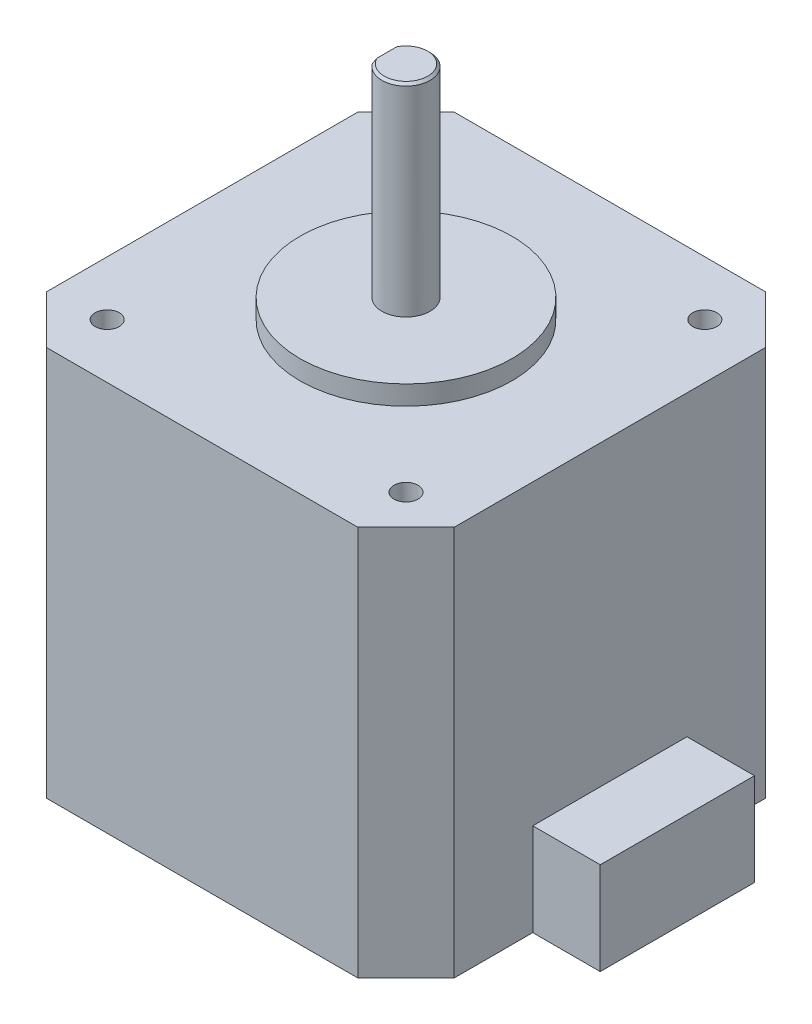
ISO-10303-21;
HEADER;
FILE_DESCRIPTION(('STEP AP214'),'2;1');
FILE_NAME('part.step','',(''),(''),'','','');
FILE_SCHEMA(('AUTOMOTIVE_DESIGN { 1 0 10303 214 1 1 1 1 }'));
ENDSEC;
DATA;
#1=APPLICATION_CONTEXT('core data for automotive mechanical design processes');
#2=APPLICATION_PROTOCOL_DEFINITION('international standard','automotive_design',2000,#1);
#3=PRODUCT_CONTEXT('',#1,'mechanical');
#4=PRODUCT('Part','Part','',(#3));
#5=PRODUCT_RELATED_PRODUCT_CATEGORY('part','',(#4));
#6=PRODUCT_DEFINITION_FORMATION('','',#4);
#7=PRODUCT_DEFINITION_CONTEXT('part definition',#1,'design');
#8=PRODUCT_DEFINITION('design','',#6,#7);
#9=PRODUCT_DEFINITION_SHAPE('','',#8);
#10=(LENGTH_UNIT() NAMED_UNIT(*) SI_UNIT(.MILLI.,.METRE.));
#11=(NAMED_UNIT(*) PLANE_ANGLE_UNIT() SI_UNIT($,.RADIAN.));
#12=(NAMED_UNIT(*) SI_UNIT($,.STERADIAN.) SOLID_ANGLE_UNIT());
#13=UNCERTAINTY_MEASURE_WITH_UNIT(LENGTH_MEASURE(1.E-05),#10,'distance_accuracy_value','');
#14=(GEOMETRIC_REPRESENTATION_CONTEXT(3) GLOBAL_UNCERTAINTY_ASSIGNED_CONTEXT((#13)) GLOBAL_UNIT_ASSIGNED_CONTEXT((#10,
#11,#12)) REPRESENTATION_CONTEXT('',''));
#15=CARTESIAN_POINT('',(0.,0.,0.));
#16=DIRECTION('',(0.,0.,1.));
#17=DIRECTION('',(1.,0.,0.));
#18=AXIS2_PLACEMENT_3D('',#15,#16,#17);
#19=CARTESIAN_POINT('',(21.15,40.5,-21.15));
#20=DIRECTION('',(-1.,0.,0.));
#21=DIRECTION('',(0.,0.,1.));
#22=AXIS2_PLACEMENT_3D('',#19,#20,#21);
#23=PLANE('',#22);
#24=DIRECTION('',(0.,1.,0.));
#25=VECTOR('',#24,1.);
#26=CARTESIAN_POINT('',(21.15,9.6,-8.));
#27=LINE('',#26,#25);
#28=CARTESIAN_POINT('',(21.15,0.,-8.));
#29=VERTEX_POINT('',#28);
#30=CARTESIAN_POINT('',(21.15,9.6,-8.));
#31=VERTEX_POINT('',#30);
#32=EDGE_CURVE('E78',#29,#31,#27,.T.);
#33=ORIENTED_EDGE('',*,*,#32,.F.);
#34=DIRECTION('',(0.,0.,-1.));
#35=VECTOR('',#34,1.);
#36=CARTESIAN_POINT('',(21.15,0.,-21.15));
#37=LINE('',#36,#35);
#38=CARTESIAN_POINT('',(21.15,0.,-16.15));
#39=VERTEX_POINT('',#38);
#40=EDGE_CURVE('E274',#29,#39,#37,.T.);
#41=ORIENTED_EDGE('',*,*,#40,.T.);
#42=DIRECTION('',(0.,1.,0.));
#43=VECTOR('',#42,1.);
#44=CARTESIAN_POINT('',(21.15,40.5,-16.15));
#45=LINE('',#44,#43);
#46=CARTESIAN_POINT('',(21.15,40.5,-16.15));
#47=VERTEX_POINT('',#46);
#48=EDGE_CURVE('E349',#39,#47,#45,.T.);
#49=ORIENTED_EDGE('',*,*,#48,.T.);
#50=DIRECTION('',(0.,0.,-1.));
#51=VECTOR('',#50,1.);
#52=CARTESIAN_POINT('',(21.15,40.5,-21.15));
#53=LINE('',#52,#51);
#54=CARTESIAN_POINT('',(21.15,40.5,16.15));
#55=VERTEX_POINT('',#54);
#56=EDGE_CURVE('E275',#55,#47,#53,.T.);
#57=ORIENTED_EDGE('',*,*,#56,.F.);
#58=DIRECTION('',(0.,-1.,0.));
#59=VECTOR('',#58,1.);
#60=CARTESIAN_POINT('',(21.15,40.5,16.15));
#61=LINE('',#60,#59);
#62=CARTESIAN_POINT('',(21.15,0.,16.15));
#63=VERTEX_POINT('',#62);
#64=EDGE_CURVE('E345',#55,#63,#61,.T.);
#65=ORIENTED_EDGE('',*,*,#64,.T.);
#66=CARTESIAN_POINT('',(21.15,0.,8.));
#67=VERTEX_POINT('',#66);
#68=EDGE_CURVE('E293',#63,#67,#37,.T.);
#69=ORIENTED_EDGE('',*,*,#68,.T.);
#70=DIRECTION('',(0.,-1.,0.));
#71=VECTOR('',#70,1.);
#72=CARTESIAN_POINT('',(21.15,9.6,8.));
#73=LINE('',#72,#71);
#74=CARTESIAN_POINT('',(21.15,9.6,8.));
#75=VERTEX_POINT('',#74);
#76=EDGE_CURVE('E199',#75,#67,#73,.T.);
#77=ORIENTED_EDGE('',*,*,#76,.F.);
#78=DIRECTION('',(0.,0.,1.));
#79=VECTOR('',#78,1.);
#80=CARTESIAN_POINT('',(21.15,9.6,8.));
#81=LINE('',#80,#79);
#82=EDGE_CURVE('E73',#31,#75,#81,.T.);
#83=ORIENTED_EDGE('',*,*,#82,.F.);
#84=EDGE_LOOP('',(#33,#41,#49,#57,#65,#69,#77,#83));
#85=FACE_BOUND('',#84,.T.);
#86=ADVANCED_FACE('F54',(#85),#23,.F.);
#87=CARTESIAN_POINT('',(-21.15,40.5,-21.15));
#88=DIRECTION('',(0.,0.,1.));
#89=DIRECTION('',(1.,0.,0.));
#90=AXIS2_PLACEMENT_3D('',#87,#88,#89);
#91=PLANE('',#90);
#92=DIRECTION('',(-1.,0.,0.));
#93=VECTOR('',#92,1.);
#94=CARTESIAN_POINT('',(-21.15,0.,-21.15));
#95=LINE('',#94,#93);
#96=CARTESIAN_POINT('',(16.15,0.,-21.15));
#97=VERTEX_POINT('',#96);
#98=CARTESIAN_POINT('',(-16.15,0.,-21.15));
#99=VERTEX_POINT('',#98);
#100=EDGE_CURVE('E296',#97,#99,#95,.T.);
#101=ORIENTED_EDGE('',*,*,#100,.T.);
#102=DIRECTION('',(0.,1.,0.));
#103=VECTOR('',#102,1.);
#104=CARTESIAN_POINT('',(-16.15,40.5,-21.15));
#105=LINE('',#104,#103);
#106=CARTESIAN_POINT('',(-16.15,40.5,-21.15));
#107=VERTEX_POINT('',#106);
#108=EDGE_CURVE('E330',#99,#107,#105,.T.);
#109=ORIENTED_EDGE('',*,*,#108,.T.);
#110=DIRECTION('',(-1.,0.,0.));
#111=VECTOR('',#110,1.);
#112=CARTESIAN_POINT('',(-21.15,40.5,-21.15));
#113=LINE('',#112,#111);
#114=CARTESIAN_POINT('',(16.15,40.5,-21.15));
#115=VERTEX_POINT('',#114);
#116=EDGE_CURVE('E279',#115,#107,#113,.T.);
#117=ORIENTED_EDGE('',*,*,#116,.F.);
#118=DIRECTION('',(0.,-1.,0.));
#119=VECTOR('',#118,1.);
#120=CARTESIAN_POINT('',(16.15,40.5,-21.15));
#121=LINE('',#120,#119);
#122=EDGE_CURVE('E326',#115,#97,#121,.T.);
#123=ORIENTED_EDGE('',*,*,#122,.T.);
#124=EDGE_LOOP('',(#101,#109,#117,#123));
#125=FACE_BOUND('',#124,.T.);
#126=ADVANCED_FACE('F465',(#125),#91,.F.);
#127=CARTESIAN_POINT('',(-21.15,40.5,-21.15));
#128=DIRECTION('',(1.,0.,0.));
#129=DIRECTION('',(0.,0.,-1.));
#130=AXIS2_PLACEMENT_3D('',#127,#128,#129);
#131=PLANE('',#130);
#132=DIRECTION('',(0.,0.,1.));
#133=VECTOR('',#132,1.);
#134=CARTESIAN_POINT('',(-21.15,40.5,-21.15));
#135=LINE('',#134,#133);
#136=CARTESIAN_POINT('',(-21.15,40.5,-16.15));
#137=VERTEX_POINT('',#136);
#138=CARTESIAN_POINT('',(-21.15,40.5,16.15));
#139=VERTEX_POINT('',#138);
#140=EDGE_CURVE('E284',#137,#139,#135,.T.);
#141=ORIENTED_EDGE('',*,*,#140,.F.);
#142=DIRECTION('',(0.,-1.,0.));
#143=VECTOR('',#142,1.);
#144=CARTESIAN_POINT('',(-21.15,40.5,-16.15));
#145=LINE('',#144,#143);
#146=CARTESIAN_POINT('',(-21.15,0.,-16.15));
#147=VERTEX_POINT('',#146);
#148=EDGE_CURVE('E309',#137,#147,#145,.T.);
#149=ORIENTED_EDGE('',*,*,#148,.T.);
#150=DIRECTION('',(0.,0.,1.));
#151=VECTOR('',#150,1.);
#152=CARTESIAN_POINT('',(-21.15,0.,-21.15));
#153=LINE('',#152,#151);
#154=CARTESIAN_POINT('',(-21.15,0.,16.15));
#155=VERTEX_POINT('',#154);
#156=EDGE_CURVE('E300',#147,#155,#153,.T.);
#157=ORIENTED_EDGE('',*,*,#156,.T.);
#158=DIRECTION('',(0.,1.,0.));
#159=VECTOR('',#158,1.);
#160=CARTESIAN_POINT('',(-21.15,40.5,16.15));
#161=LINE('',#160,#159);
#162=EDGE_CURVE('E292',#155,#139,#161,.T.);
#163=ORIENTED_EDGE('',*,*,#162,.T.);
#164=EDGE_LOOP('',(#141,#149,#157,#163));
#165=FACE_BOUND('',#164,.T.);
#166=ADVANCED_FACE('F461',(#165),#131,.F.);
#167=CARTESIAN_POINT('',(-21.15,40.5,21.15));
#168=DIRECTION('',(0.,0.,-1.));
#169=DIRECTION('',(-1.,0.,0.));
#170=AXIS2_PLACEMENT_3D('',#167,#168,#169);
#171=PLANE('',#170);
#172=DIRECTION('',(1.,0.,0.));
#173=VECTOR('',#172,1.);
#174=CARTESIAN_POINT('',(-21.15,0.,21.15));
#175=LINE('',#174,#173);
#176=CARTESIAN_POINT('',(-16.15,0.,21.15));
#177=VERTEX_POINT('',#176);
#178=CARTESIAN_POINT('',(16.15,0.,21.15));
#179=VERTEX_POINT('',#178);
#180=EDGE_CURVE('E280',#177,#179,#175,.T.);
#181=ORIENTED_EDGE('',*,*,#180,.T.);
#182=DIRECTION('',(0.,1.,0.));
#183=VECTOR('',#182,1.);
#184=CARTESIAN_POINT('',(16.15,40.5,21.15));
#185=LINE('',#184,#183);
#186=CARTESIAN_POINT('',(16.15,40.5,21.15));
#187=VERTEX_POINT('',#186);
#188=EDGE_CURVE('E356',#179,#187,#185,.T.);
#189=ORIENTED_EDGE('',*,*,#188,.T.);
#190=DIRECTION('',(1.,0.,0.));
#191=VECTOR('',#190,1.);
#192=CARTESIAN_POINT('',(-21.15,40.5,21.15));
#193=LINE('',#192,#191);
#194=CARTESIAN_POINT('',(-16.15,40.5,21.15));
#195=VERTEX_POINT('',#194);
#196=EDGE_CURVE('E288',#195,#187,#193,.T.);
#197=ORIENTED_EDGE('',*,*,#196,.F.);
#198=DIRECTION('',(0.,-1.,0.));
#199=VECTOR('',#198,1.);
#200=CARTESIAN_POINT('',(-16.15,40.5,21.15));
#201=LINE('',#200,#199);
#202=EDGE_CURVE('E352',#195,#177,#201,.T.);
#203=ORIENTED_EDGE('',*,*,#202,.T.);
#204=EDGE_LOOP('',(#181,#189,#197,#203));
#205=FACE_BOUND('',#204,.T.);
#206=ADVANCED_FACE('F454',(#205),#171,.F.);
#207=CARTESIAN_POINT('',(0.,40.5,0.));
#208=DIRECTION('',(0.,1.,0.));
#209=DIRECTION('',(0.,0.,1.));
#210=AXIS2_PLACEMENT_3D('',#207,#208,#209);
#211=PLANE('',#210);
#212=CARTESIAN_POINT('',(0.,40.5,0.));
#213=DIRECTION('',(0.,1.,0.));
#214=DIRECTION('',(0.,0.,1.));
#215=AXIS2_PLACEMENT_3D('',#212,#213,#214);
#216=CIRCLE('',#215,11.);
#217=CARTESIAN_POINT('',(0.,40.5,11.));
#218=VERTEX_POINT('',#217);
#219=EDGE_CURVE('E231',#218,#218,#216,.T.);
#220=ORIENTED_EDGE('',*,*,#219,.F.);
#221=EDGE_LOOP('',(#220));
#222=FACE_BOUND('',#221,.T.);
#223=CARTESIAN_POINT('',(15.5,40.5,-15.5));
#224=DIRECTION('',(0.,1.,0.));
#225=DIRECTION('',(0.,0.,1.));
#226=AXIS2_PLACEMENT_3D('',#223,#224,#225);
#227=CIRCLE('',#226,1.24999999999999);
#228=CARTESIAN_POINT('',(15.5,40.5,-14.25));
#229=VERTEX_POINT('',#228);
#230=EDGE_CURVE('E242',#229,#229,#227,.T.);
#231=ORIENTED_EDGE('',*,*,#230,.F.);
#232=EDGE_LOOP('',(#231));
#233=FACE_BOUND('',#232,.T.);
#234=CARTESIAN_POINT('',(-15.5,40.5,15.5));
#235=DIRECTION('',(0.,1.,0.));
#236=DIRECTION('',(0.,0.,1.));
#237=AXIS2_PLACEMENT_3D('',#234,#235,#236);
#238=CIRCLE('',#237,1.24999999999999);
#239=CARTESIAN_POINT('',(-15.5,40.5,16.75));
#240=VERTEX_POINT('',#239);
#241=EDGE_CURVE('E250',#240,#240,#238,.T.);
#242=ORIENTED_EDGE('',*,*,#241,.F.);
#243=EDGE_LOOP('',(#242));
#244=FACE_BOUND('',#243,.T.);
#245=CARTESIAN_POINT('',(-15.5,40.5,-15.5));
#246=DIRECTION('',(0.,1.,0.));
#247=DIRECTION('',(0.,0.,1.));
#248=AXIS2_PLACEMENT_3D('',#245,#246,#247);
#249=CIRCLE('',#248,1.24999999999999);
#250=CARTESIAN_POINT('',(-15.5,40.5,-14.25));
#251=VERTEX_POINT('',#250);
#252=EDGE_CURVE('E258',#251,#251,#249,.T.);
#253=ORIENTED_EDGE('',*,*,#252,.F.);
#254=EDGE_LOOP('',(#253));
#255=FACE_BOUND('',#254,.T.);
#256=CARTESIAN_POINT('',(15.5,40.5,15.5));
#257=DIRECTION('',(0.,1.,0.));
#258=DIRECTION('',(0.,0.,1.));
#259=AXIS2_PLACEMENT_3D('',#256,#257,#258);
#260=CIRCLE('',#259,1.24999999999999);
#261=CARTESIAN_POINT('',(15.5,40.5,16.75));
#262=VERTEX_POINT('',#261);
#263=EDGE_CURVE('E266',#262,#262,#260,.T.);
#264=ORIENTED_EDGE('',*,*,#263,.F.);
#265=EDGE_LOOP('',(#264));
#266=FACE_BOUND('',#265,.T.);
#267=ORIENTED_EDGE('',*,*,#116,.T.);
#268=DIRECTION('',(0.707106781186549,0.,-0.707106781186546));
#269=VECTOR('',#268,1.);
#270=CARTESIAN_POINT('',(-18.65,40.5,-18.65));
#271=LINE('',#270,#269);
#272=EDGE_CURVE('E342',#107,#137,#271,.F.);
#273=ORIENTED_EDGE('',*,*,#272,.T.);
#274=ORIENTED_EDGE('',*,*,#140,.T.);
#275=DIRECTION('',(-0.707106781186546,0.,-0.707106781186549));
#276=VECTOR('',#275,1.);
#277=CARTESIAN_POINT('',(-18.65,40.5,18.65));
#278=LINE('',#277,#276);
#279=EDGE_CURVE('E333',#139,#195,#278,.F.);
#280=ORIENTED_EDGE('',*,*,#279,.T.);
#281=ORIENTED_EDGE('',*,*,#196,.T.);
#282=DIRECTION('',(-0.707106781186549,0.,0.707106781186546));
#283=VECTOR('',#282,1.);
#284=CARTESIAN_POINT('',(18.65,40.5,18.65));
#285=LINE('',#284,#283);
#286=EDGE_CURVE('E336',#187,#55,#285,.F.);
#287=ORIENTED_EDGE('',*,*,#286,.T.);
#288=ORIENTED_EDGE('',*,*,#56,.T.);
#289=DIRECTION('',(0.707106781186547,0.,0.707106781186549));
#290=VECTOR('',#289,1.);
#291=CARTESIAN_POINT('',(18.65,40.5,-18.65));
#292=LINE('',#291,#290);
#293=EDGE_CURVE('E339',#47,#115,#292,.F.);
#294=ORIENTED_EDGE('',*,*,#293,.T.);
#295=EDGE_LOOP('',(#267,#273,#274,#280,#281,#287,#288,#294));
#296=FACE_BOUND('',#295,.T.);
#297=ADVANCED_FACE('F451',(#222,#233,#244,#255,#266,#296),#211,.T.);
#298=CARTESIAN_POINT('',(0.,0.,0.));
#299=DIRECTION('',(0.,1.,0.));
#300=DIRECTION('',(0.,0.,1.));
#301=AXIS2_PLACEMENT_3D('',#298,#299,#300);
#302=PLANE('',#301);
#303=ORIENTED_EDGE('',*,*,#156,.F.);
#304=DIRECTION('',(-0.707106781186549,0.,0.707106781186546));
#305=VECTOR('',#304,1.);
#306=CARTESIAN_POINT('',(-21.15,0.,-16.15));
#307=LINE('',#306,#305);
#308=EDGE_CURVE('E323',#147,#99,#307,.F.);
#309=ORIENTED_EDGE('',*,*,#308,.T.);
#310=ORIENTED_EDGE('',*,*,#100,.F.);
#311=DIRECTION('',(-0.707106781186547,0.,-0.707106781186549));
#312=VECTOR('',#311,1.);
#313=CARTESIAN_POINT('',(16.15,0.,-21.15));
#314=LINE('',#313,#312);
#315=EDGE_CURVE('E319',#97,#39,#314,.F.);
#316=ORIENTED_EDGE('',*,*,#315,.T.);
#317=ORIENTED_EDGE('',*,*,#40,.F.);
#318=DIRECTION('',(-1.,0.,0.));
#319=VECTOR('',#318,1.);
#320=CARTESIAN_POINT('',(28.15,0.,-8.));
#321=LINE('',#320,#319);
#322=CARTESIAN_POINT('',(28.15,0.,-8.));
#323=VERTEX_POINT('',#322);
#324=EDGE_CURVE('E531',#323,#29,#321,.T.);
#325=ORIENTED_EDGE('',*,*,#324,.F.);
#326=DIRECTION('',(0.,0.,-1.));
#327=VECTOR('',#326,1.);
#328=CARTESIAN_POINT('',(28.15,0.,8.));
#329=LINE('',#328,#327);
#330=CARTESIAN_POINT('',(28.15,0.,8.));
#331=VERTEX_POINT('',#330);
#332=EDGE_CURVE('E194',#331,#323,#329,.T.);
#333=ORIENTED_EDGE('',*,*,#332,.F.);
#334=DIRECTION('',(-1.,0.,0.));
#335=VECTOR('',#334,1.);
#336=CARTESIAN_POINT('',(28.15,0.,8.));
#337=LINE('',#336,#335);
#338=EDGE_CURVE('E210',#331,#67,#337,.T.);
#339=ORIENTED_EDGE('',*,*,#338,.T.);
#340=ORIENTED_EDGE('',*,*,#68,.F.);
#341=DIRECTION('',(0.707106781186549,0.,-0.707106781186546));
#342=VECTOR('',#341,1.);
#343=CARTESIAN_POINT('',(21.15,0.,16.15));
#344=LINE('',#343,#342);
#345=EDGE_CURVE('E316',#63,#179,#344,.F.);
#346=ORIENTED_EDGE('',*,*,#345,.T.);
#347=ORIENTED_EDGE('',*,*,#180,.F.);
#348=DIRECTION('',(0.707106781186546,0.,0.707106781186549));
#349=VECTOR('',#348,1.);
#350=CARTESIAN_POINT('',(-16.15,0.,21.15));
#351=LINE('',#350,#349);
#352=EDGE_CURVE('E313',#177,#155,#351,.F.);
#353=ORIENTED_EDGE('',*,*,#352,.T.);
#354=EDGE_LOOP('',(#303,#309,#310,#316,#317,#325,#333,#339,#340,#346,#347,#353));
#355=FACE_BOUND('',#354,.T.);
#356=ADVANCED_FACE('F449',(#355),#302,.F.);
#357=CARTESIAN_POINT('',(15.5,34.5,15.5));
#358=DIRECTION('',(0.,1.,0.));
#359=DIRECTION('',(0.,0.,1.));
#360=AXIS2_PLACEMENT_3D('',#357,#358,#359);
#361=CONICAL_SURFACE('',#360,1.25,1.02974425867665);
#362=CARTESIAN_POINT('',(15.5,33.7489242262155,15.5));
#363=VERTEX_POINT('',#362);
#364=VERTEX_LOOP('',#363);
#365=FACE_BOUND('',#364,.T.);
#366=CARTESIAN_POINT('',(15.5,34.5,15.5));
#367=DIRECTION('',(0.,1.,0.));
#368=DIRECTION('',(0.,0.,1.));
#369=AXIS2_PLACEMENT_3D('',#366,#367,#368);
#370=CIRCLE('',#369,1.25);
#371=CARTESIAN_POINT('',(15.5,34.5,16.75));
#372=VERTEX_POINT('',#371);
#373=EDGE_CURVE('E270',#372,#372,#370,.T.);
#374=ORIENTED_EDGE('',*,*,#373,.T.);
#375=EDGE_LOOP('',(#374));
#376=FACE_BOUND('',#375,.T.);
#377=ADVANCED_FACE('F445',(#365,#376),#361,.F.);
#378=CARTESIAN_POINT('',(15.5,40.5,15.5));
#379=DIRECTION('',(0.,1.,0.));
#380=DIRECTION('',(0.,0.,1.));
#381=AXIS2_PLACEMENT_3D('',#378,#379,#380);
#382=CYLINDRICAL_SURFACE('',#381,1.24999999999999);
#383=ORIENTED_EDGE('',*,*,#373,.F.);
#384=EDGE_LOOP('',(#383));
#385=FACE_BOUND('',#384,.T.);
#386=ORIENTED_EDGE('',*,*,#263,.T.);
#387=EDGE_LOOP('',(#386));
#388=FACE_BOUND('',#387,.T.);
#389=ADVANCED_FACE('F441',(#385,#388),#382,.F.);
#390=CARTESIAN_POINT('',(-15.5,34.5,-15.5));
#391=DIRECTION('',(0.,1.,0.));
#392=DIRECTION('',(0.,0.,1.));
#393=AXIS2_PLACEMENT_3D('',#390,#391,#392);
#394=CONICAL_SURFACE('',#393,1.25,1.02974425867665);
#395=CARTESIAN_POINT('',(-15.5,33.7489242262155,-15.5));
#396=VERTEX_POINT('',#395);
#397=VERTEX_LOOP('',#396);
#398=FACE_BOUND('',#397,.T.);
#399=CARTESIAN_POINT('',(-15.5,34.5,-15.5));
#400=DIRECTION('',(0.,1.,0.));
#401=DIRECTION('',(0.,0.,1.));
#402=AXIS2_PLACEMENT_3D('',#399,#400,#401);
#403=CIRCLE('',#402,1.25);
#404=CARTESIAN_POINT('',(-15.5,34.5,-14.25));
#405=VERTEX_POINT('',#404);
#406=EDGE_CURVE('E262',#405,#405,#403,.T.);
#407=ORIENTED_EDGE('',*,*,#406,.T.);
#408=EDGE_LOOP('',(#407));
#409=FACE_BOUND('',#408,.T.);
#410=ADVANCED_FACE('F437',(#398,#409),#394,.F.);
#411=CARTESIAN_POINT('',(-15.5,40.5,-15.5));
#412=DIRECTION('',(0.,1.,0.));
#413=DIRECTION('',(0.,0.,1.));
#414=AXIS2_PLACEMENT_3D('',#411,#412,#413);
#415=CYLINDRICAL_SURFACE('',#414,1.24999999999999);
#416=ORIENTED_EDGE('',*,*,#406,.F.);
#417=EDGE_LOOP('',(#416));
#418=FACE_BOUND('',#417,.T.);
#419=ORIENTED_EDGE('',*,*,#252,.T.);
#420=EDGE_LOOP('',(#419));
#421=FACE_BOUND('',#420,.T.);
#422=ADVANCED_FACE('F433',(#418,#421),#415,.F.);
#423=CARTESIAN_POINT('',(-15.5,34.5,15.5));
#424=DIRECTION('',(0.,1.,0.));
#425=DIRECTION('',(0.,0.,1.));
#426=AXIS2_PLACEMENT_3D('',#423,#424,#425);
#427=CONICAL_SURFACE('',#426,1.25,1.02974425867665);
#428=CARTESIAN_POINT('',(-15.5,33.7489242262155,15.5));
#429=VERTEX_POINT('',#428);
#430=VERTEX_LOOP('',#429);
#431=FACE_BOUND('',#430,.T.);
#432=CARTESIAN_POINT('',(-15.5,34.5,15.5));
#433=DIRECTION('',(0.,1.,0.));
#434=DIRECTION('',(0.,0.,1.));
#435=AXIS2_PLACEMENT_3D('',#432,#433,#434);
#436=CIRCLE('',#435,1.25);
#437=CARTESIAN_POINT('',(-15.5,34.5,16.75));
#438=VERTEX_POINT('',#437);
#439=EDGE_CURVE('E254',#438,#438,#436,.T.);
#440=ORIENTED_EDGE('',*,*,#439,.T.);
#441=EDGE_LOOP('',(#440));
#442=FACE_BOUND('',#441,.T.);
#443=ADVANCED_FACE('F429',(#431,#442),#427,.F.);
#444=CARTESIAN_POINT('',(-15.5,40.5,15.5));
#445=DIRECTION('',(0.,1.,0.));
#446=DIRECTION('',(0.,0.,1.));
#447=AXIS2_PLACEMENT_3D('',#444,#445,#446);
#448=CYLINDRICAL_SURFACE('',#447,1.24999999999999);
#449=ORIENTED_EDGE('',*,*,#439,.F.);
#450=EDGE_LOOP('',(#449));
#451=FACE_BOUND('',#450,.T.);
#452=ORIENTED_EDGE('',*,*,#241,.T.);
#453=EDGE_LOOP('',(#452));
#454=FACE_BOUND('',#453,.T.);
#455=ADVANCED_FACE('F425',(#451,#454),#448,.F.);
#456=CARTESIAN_POINT('',(15.5,34.5,-15.5));
#457=DIRECTION('',(0.,1.,0.));
#458=DIRECTION('',(0.,0.,1.));
#459=AXIS2_PLACEMENT_3D('',#456,#457,#458);
#460=CONICAL_SURFACE('',#459,1.25,1.02974425867665);
#461=CARTESIAN_POINT('',(15.5,33.7489242262155,-15.5));
#462=VERTEX_POINT('',#461);
#463=VERTEX_LOOP('',#462);
#464=FACE_BOUND('',#463,.T.);
#465=CARTESIAN_POINT('',(15.5,34.5,-15.5));
#466=DIRECTION('',(0.,1.,0.));
#467=DIRECTION('',(0.,0.,1.));
#468=AXIS2_PLACEMENT_3D('',#465,#466,#467);
#469=CIRCLE('',#468,1.25);
#470=CARTESIAN_POINT('',(15.5,34.5,-14.25));
#471=VERTEX_POINT('',#470);
#472=EDGE_CURVE('E246',#471,#471,#469,.T.);
#473=ORIENTED_EDGE('',*,*,#472,.T.);
#474=EDGE_LOOP('',(#473));
#475=FACE_BOUND('',#474,.T.);
#476=ADVANCED_FACE('F421',(#464,#475),#460,.F.);
#477=CARTESIAN_POINT('',(15.5,40.5,-15.5));
#478=DIRECTION('',(0.,1.,0.));
#479=DIRECTION('',(0.,0.,1.));
#480=AXIS2_PLACEMENT_3D('',#477,#478,#479);
#481=CYLINDRICAL_SURFACE('',#480,1.24999999999999);
#482=ORIENTED_EDGE('',*,*,#472,.F.);
#483=EDGE_LOOP('',(#482));
#484=FACE_BOUND('',#483,.T.);
#485=ORIENTED_EDGE('',*,*,#230,.T.);
#486=EDGE_LOOP('',(#485));
#487=FACE_BOUND('',#486,.T.);
#488=ADVANCED_FACE('F417',(#484,#487),#481,.F.);
#489=CARTESIAN_POINT('',(-21.15,40.5,-16.15));
#490=DIRECTION('',(0.707106781186546,0.,0.707106781186549));
#491=DIRECTION('',(0.,-1.,0.));
#492=AXIS2_PLACEMENT_3D('',#489,#490,#491);
#493=PLANE('',#492);
#494=ORIENTED_EDGE('',*,*,#272,.F.);
#495=ORIENTED_EDGE('',*,*,#108,.F.);
#496=ORIENTED_EDGE('',*,*,#308,.F.);
#497=ORIENTED_EDGE('',*,*,#148,.F.);
#498=EDGE_LOOP('',(#494,#495,#496,#497));
#499=FACE_BOUND('',#498,.T.);
#500=ADVANCED_FACE('F420',(#499),#493,.F.);
#501=CARTESIAN_POINT('',(16.15,40.5,-21.15));
#502=DIRECTION('',(-0.707106781186548,0.,0.707106781186546));
#503=DIRECTION('',(0.,-1.,0.));
#504=AXIS2_PLACEMENT_3D('',#501,#502,#503);
#505=PLANE('',#504);
#506=ORIENTED_EDGE('',*,*,#293,.F.);
#507=ORIENTED_EDGE('',*,*,#48,.F.);
#508=ORIENTED_EDGE('',*,*,#315,.F.);
#509=ORIENTED_EDGE('',*,*,#122,.F.);
#510=EDGE_LOOP('',(#506,#507,#508,#509));
#511=FACE_BOUND('',#510,.T.);
#512=ADVANCED_FACE('F478',(#511),#505,.F.);
#513=CARTESIAN_POINT('',(21.15,40.5,16.15));
#514=DIRECTION('',(-0.707106781186546,0.,-0.707106781186549));
#515=DIRECTION('',(0.,-1.,0.));
#516=AXIS2_PLACEMENT_3D('',#513,#514,#515);
#517=PLANE('',#516);
#518=ORIENTED_EDGE('',*,*,#286,.F.);
#519=ORIENTED_EDGE('',*,*,#188,.F.);
#520=ORIENTED_EDGE('',*,*,#345,.F.);
#521=ORIENTED_EDGE('',*,*,#64,.F.);
#522=EDGE_LOOP('',(#518,#519,#520,#521));
#523=FACE_BOUND('',#522,.T.);
#524=ADVANCED_FACE('F485',(#523),#517,.F.);
#525=CARTESIAN_POINT('',(-16.15,40.5,21.15));
#526=DIRECTION('',(0.707106781186549,0.,-0.707106781186546));
#527=DIRECTION('',(0.,-1.,0.));
#528=AXIS2_PLACEMENT_3D('',#525,#526,#527);
#529=PLANE('',#528);
#530=ORIENTED_EDGE('',*,*,#279,.F.);
#531=ORIENTED_EDGE('',*,*,#162,.F.);
#532=ORIENTED_EDGE('',*,*,#352,.F.);
#533=ORIENTED_EDGE('',*,*,#202,.F.);
#534=EDGE_LOOP('',(#530,#531,#532,#533));
#535=FACE_BOUND('',#534,.T.);
#536=ADVANCED_FACE('F408',(#535),#529,.F.);
#537=CARTESIAN_POINT('',(0.,42.5,0.));
#538=DIRECTION('',(0.,-1.,0.));
#539=DIRECTION('',(0.,0.,-1.));
#540=AXIS2_PLACEMENT_3D('',#537,#538,#539);
#541=CYLINDRICAL_SURFACE('',#540,11.);
#542=CARTESIAN_POINT('',(0.,42.5,0.));
#543=DIRECTION('',(0.,1.,0.));
#544=DIRECTION('',(0.,0.,1.));
#545=AXIS2_PLACEMENT_3D('',#542,#543,#544);
#546=CIRCLE('',#545,11.);
#547=CARTESIAN_POINT('',(0.,42.5,11.));
#548=VERTEX_POINT('',#547);
#549=EDGE_CURVE('E226',#548,#548,#546,.T.);
#550=ORIENTED_EDGE('',*,*,#549,.F.);
#551=EDGE_LOOP('',(#550));
#552=FACE_BOUND('',#551,.T.);
#553=ORIENTED_EDGE('',*,*,#219,.T.);
#554=EDGE_LOOP('',(#553));
#555=FACE_BOUND('',#554,.T.);
#556=ADVANCED_FACE('F398',(#552,#555),#541,.T.);
#557=CARTESIAN_POINT('',(0.,42.5,0.));
#558=DIRECTION('',(0.,1.,0.));
#559=DIRECTION('',(0.,0.,1.));
#560=AXIS2_PLACEMENT_3D('',#557,#558,#559);
#561=PLANE('',#560);
#562=CARTESIAN_POINT('',(0.,42.5,0.));
#563=DIRECTION('',(0.,1.,0.));
#564=DIRECTION('',(0.,0.,1.));
#565=AXIS2_PLACEMENT_3D('',#562,#563,#564);
#566=CIRCLE('',#565,2.5);
#567=CARTESIAN_POINT('',(0.,42.5,2.5));
#568=VERTEX_POINT('',#567);
#569=EDGE_CURVE('E225',#568,#568,#566,.F.);
#570=ORIENTED_EDGE('',*,*,#569,.T.);
#571=EDGE_LOOP('',(#570));
#572=FACE_BOUND('',#571,.T.);
#573=ORIENTED_EDGE('',*,*,#549,.T.);
#574=EDGE_LOOP('',(#573));
#575=FACE_BOUND('',#574,.T.);
#576=ADVANCED_FACE('F394',(#572,#575),#561,.T.);
#577=CARTESIAN_POINT('',(0.,63.5,0.));
#578=DIRECTION('',(0.,-1.,0.));
#579=DIRECTION('',(0.,0.,-1.));
#580=AXIS2_PLACEMENT_3D('',#577,#578,#579);
#581=CYLINDRICAL_SURFACE('',#580,2.5);
#582=CARTESIAN_POINT('',(0.,63.25,0.));
#583=DIRECTION('',(0.,1.,0.));
#584=DIRECTION('',(0.,0.,1.));
#585=AXIS2_PLACEMENT_3D('',#582,#583,#584);
#586=CIRCLE('',#585,2.5);
#587=CARTESIAN_POINT('',(-2.,63.25,-1.5));
#588=VERTEX_POINT('',#587);
#589=CARTESIAN_POINT('',(-2.,63.25,1.5));
#590=VERTEX_POINT('',#589);
#591=EDGE_CURVE('E366',#588,#590,#586,.F.);
#592=ORIENTED_EDGE('',*,*,#591,.T.);
#593=DIRECTION('',(0.,-1.,0.));
#594=VECTOR('',#593,1.);
#595=CARTESIAN_POINT('',(-2.,63.5,1.5));
#596=LINE('',#595,#594);
#597=CARTESIAN_POINT('',(-2.,45.5,1.5));
#598=VERTEX_POINT('',#597);
#599=EDGE_CURVE('E221',#590,#598,#596,.T.);
#600=ORIENTED_EDGE('',*,*,#599,.T.);
#601=CARTESIAN_POINT('',(0.,45.5,0.));
#602=DIRECTION('',(0.,-1.,0.));
#603=DIRECTION('',(0.,0.,-1.));
#604=AXIS2_PLACEMENT_3D('',#601,#602,#603);
#605=CIRCLE('',#604,2.5);
#606=CARTESIAN_POINT('',(-2.,45.5,-1.5));
#607=VERTEX_POINT('',#606);
#608=EDGE_CURVE('E11',#598,#607,#605,.T.);
#609=ORIENTED_EDGE('',*,*,#608,.T.);
#610=DIRECTION('',(0.,-1.,0.));
#611=VECTOR('',#610,1.);
#612=CARTESIAN_POINT('',(-2.,63.5,-1.5));
#613=LINE('',#612,#611);
#614=EDGE_CURVE('E216',#607,#588,#613,.F.);
#615=ORIENTED_EDGE('',*,*,#614,.T.);
#616=EDGE_LOOP('',(#592,#600,#609,#615));
#617=FACE_BOUND('',#616,.T.);
#618=ORIENTED_EDGE('',*,*,#569,.F.);
#619=EDGE_LOOP('',(#618));
#620=FACE_BOUND('',#619,.T.);
#621=ADVANCED_FACE('F390',(#617,#620),#581,.T.);
#622=CARTESIAN_POINT('',(0.,63.5,0.));
#623=DIRECTION('',(0.,1.,0.));
#624=DIRECTION('',(0.,0.,1.));
#625=AXIS2_PLACEMENT_3D('',#622,#623,#624);
#626=PLANE('',#625);
#627=DIRECTION('',(0.,0.,1.));
#628=VECTOR('',#627,1.);
#629=CARTESIAN_POINT('',(-2.,63.5,-21.15));
#630=LINE('',#629,#628);
#631=CARTESIAN_POINT('',(-2.,63.5,-1.03077640640442));
#632=VERTEX_POINT('',#631);
#633=CARTESIAN_POINT('',(-2.,63.5,1.03077640640441));
#634=VERTEX_POINT('',#633);
#635=EDGE_CURVE('E208',#632,#634,#630,.T.);
#636=ORIENTED_EDGE('',*,*,#635,.T.);
#637=CARTESIAN_POINT('',(0.,63.5,0.));
#638=DIRECTION('',(0.,1.,0.));
#639=DIRECTION('',(0.,0.,1.));
#640=AXIS2_PLACEMENT_3D('',#637,#638,#639);
#641=CIRCLE('',#640,2.25);
#642=EDGE_CURVE('E359',#634,#632,#641,.T.);
#643=ORIENTED_EDGE('',*,*,#642,.T.);
#644=EDGE_LOOP('',(#636,#643));
#645=FACE_BOUND('',#644,.T.);
#646=ADVANCED_FACE('F387',(#645),#626,.T.);
#647=CARTESIAN_POINT('',(0.,63.5,0.));
#648=DIRECTION('',(0.,-1.,0.));
#649=DIRECTION('',(0.,0.,-1.));
#650=AXIS2_PLACEMENT_3D('',#647,#648,#649);
#651=CONICAL_SURFACE('',#650,2.25,0.785398163397444);
#652=CARTESIAN_POINT('',(-2.,63.2493,1.50116637652195));
#653=CARTESIAN_POINT('',(-2.,63.2934401346316,1.42755014292172));
#654=CARTESIAN_POINT('',(-2.,63.3361581469955,1.35300619482354));
#655=CARTESIAN_POINT('',(-2.,63.417751861814,1.20147433885885));
#656=CARTESIAN_POINT('',(-2.,63.4566116681996,1.1244779171654));
#657=CARTESIAN_POINT('',(-2.,63.529780311175,0.966612315218656));
#658=CARTESIAN_POINT('',(-2.,63.5639937993838,0.885698218342493));
#659=CARTESIAN_POINT('',(-2.,63.6252762656485,0.721284240149933));
#660=CARTESIAN_POINT('',(-2.,63.6523561832485,0.637788540143629));
#661=CARTESIAN_POINT('',(-2.,63.6904765816635,0.494768757995287));
#662=CARTESIAN_POINT('',(-2.,63.7038857853051,0.435877141968679));
#663=CARTESIAN_POINT('',(-2.,63.7258449680108,0.317177796692855));
#664=CARTESIAN_POINT('',(-2.,63.734394890121,0.257370056714489));
#665=CARTESIAN_POINT('',(-2.,63.7461362849154,0.137762765526398));
#666=CARTESIAN_POINT('',(-2.,63.7493748985131,0.0779679048074623));
#667=CARTESIAN_POINT('',(-2.,63.7504604059443,-0.0416692618881332));
#668=CARTESIAN_POINT('',(-2.,63.7483074905891,-0.101511566110792));
#669=CARTESIAN_POINT('',(-2.,63.7387402595294,-0.220646424402909));
#670=CARTESIAN_POINT('',(-2.,63.7313366731977,-0.27993985017786));
#671=CARTESIAN_POINT('',(-2.,63.7116657737236,-0.397724633127019));
#672=CARTESIAN_POINT('',(-2.,63.6993960487934,-0.456215577675213));
#673=CARTESIAN_POINT('',(-2.,63.6558808451371,-0.630966994730005));
#674=CARTESIAN_POINT('',(-2.,63.6180154903307,-0.745605355825509));
#675=CARTESIAN_POINT('',(-2.,63.5516511152103,-0.914024186892208));
#676=CARTESIAN_POINT('',(-2.,63.527825514378,-0.969780477907856));
#677=CARTESIAN_POINT('',(-2.,63.4775085603786,-1.08010287934099));
#678=CARTESIAN_POINT('',(-2.,63.4510167230421,-1.13466877139361));
#679=CARTESIAN_POINT('',(-2.,63.3962864186931,-1.24179676216277));
#680=CARTESIAN_POINT('',(-2.,63.3680829937027,-1.29437698305996));
#681=CARTESIAN_POINT('',(-2.,63.3099234828744,-1.39850652188709));
#682=CARTESIAN_POINT('',(-2.,63.2799688071306,-1.45005662557503));
#683=CARTESIAN_POINT('',(-2.,63.2493,-1.50116637652195));
#684=B_SPLINE_CURVE_WITH_KNOTS('',3,(#652,#653,#654,#655,#656,#657,#658,#659,#660,#661,#662,
#663,#664,#665,#666,#667,#668,#669,#670,#671,#672,#673,#674,#675,#676,#677,#678,#679,#680,#681,
#682,#683),.UNSPECIFIED.,.F.,.F.,(4,2,2,2,2,2,2,2,2,2,2,2,2,2,2,4),(0.,0.257586957004288,
0.516194613608651,0.779493699287226,1.04238662586604,1.22340856880459,1.4044326333982,
1.5838411346606,1.76324328657543,1.94227989530285,2.12140535045478,2.4823412297128,
2.6642063478423,2.84610455117016,3.02507039240797,3.20389406496804),.UNSPECIFIED.);
#685=EDGE_CURVE('E66',#590,#634,#684,.T.);
#686=ORIENTED_EDGE('',*,*,#685,.F.);
#687=ORIENTED_EDGE('',*,*,#591,.F.);
#688=EDGE_CURVE('E369',#632,#588,#684,.T.);
#689=ORIENTED_EDGE('',*,*,#688,.F.);
#690=ORIENTED_EDGE('',*,*,#642,.F.);
#691=EDGE_LOOP('',(#686,#687,#689,#690));
#692=FACE_BOUND('',#691,.T.);
#693=ADVANCED_FACE('F57',(#692),#651,.T.);
#694=CARTESIAN_POINT('',(-2.5,45.5,-21.15));
#695=DIRECTION('',(0.,-1.,0.));
#696=DIRECTION('',(0.,0.,-1.));
#697=AXIS2_PLACEMENT_3D('',#694,#695,#696);
#698=PLANE('',#697);
#699=DIRECTION('',(0.,0.,1.));
#700=VECTOR('',#699,1.);
#701=CARTESIAN_POINT('',(-2.,45.5,-21.15));
#702=LINE('',#701,#700);
#703=EDGE_CURVE('E203',#607,#598,#702,.T.);
#704=ORIENTED_EDGE('',*,*,#703,.F.);
#705=ORIENTED_EDGE('',*,*,#608,.F.);
#706=EDGE_LOOP('',(#704,#705));
#707=FACE_BOUND('',#706,.T.);
#708=ADVANCED_FACE('F381',(#707),#698,.F.);
#709=CARTESIAN_POINT('',(-2.,63.5,-21.15));
#710=DIRECTION('',(1.,0.,0.));
#711=DIRECTION('',(0.,0.,-1.));
#712=AXIS2_PLACEMENT_3D('',#709,#710,#711);
#713=PLANE('',#712);
#714=ORIENTED_EDGE('',*,*,#685,.T.);
#715=ORIENTED_EDGE('',*,*,#635,.F.);
#716=ORIENTED_EDGE('',*,*,#688,.T.);
#717=ORIENTED_EDGE('',*,*,#614,.F.);
#718=ORIENTED_EDGE('',*,*,#703,.T.);
#719=ORIENTED_EDGE('',*,*,#599,.F.);
#720=EDGE_LOOP('',(#714,#715,#716,#717,#718,#719));
#721=FACE_BOUND('',#720,.T.);
#722=ADVANCED_FACE('F376',(#721),#713,.F.);
#723=CARTESIAN_POINT('',(28.15,9.6,-8.));
#724=DIRECTION('',(0.,0.,1.));
#725=DIRECTION('',(0.,-1.,0.));
#726=AXIS2_PLACEMENT_3D('',#723,#724,#725);
#727=PLANE('',#726);
#728=ORIENTED_EDGE('',*,*,#32,.T.);
#729=DIRECTION('',(-1.,0.,0.));
#730=VECTOR('',#729,1.);
#731=CARTESIAN_POINT('',(28.15,9.6,-8.));
#732=LINE('',#731,#730);
#733=CARTESIAN_POINT('',(28.15,9.6,-8.));
#734=VERTEX_POINT('',#733);
#735=EDGE_CURVE('E182',#734,#31,#732,.T.);
#736=ORIENTED_EDGE('',*,*,#735,.F.);
#737=DIRECTION('',(0.,1.,0.));
#738=VECTOR('',#737,1.);
#739=CARTESIAN_POINT('',(28.15,9.6,-8.));
#740=LINE('',#739,#738);
#741=EDGE_CURVE('E189',#323,#734,#740,.T.);
#742=ORIENTED_EDGE('',*,*,#741,.F.);
#743=ORIENTED_EDGE('',*,*,#324,.T.);
#744=EDGE_LOOP('',(#728,#736,#742,#743));
#745=FACE_BOUND('',#744,.T.);
#746=ADVANCED_FACE('F201',(#745),#727,.F.);
#747=CARTESIAN_POINT('',(28.15,9.6,8.));
#748=DIRECTION('',(0.,-1.,0.));
#749=DIRECTION('',(0.,0.,-1.));
#750=AXIS2_PLACEMENT_3D('',#747,#748,#749);
#751=PLANE('',#750);
#752=ORIENTED_EDGE('',*,*,#82,.T.);
#753=DIRECTION('',(-1.,0.,0.));
#754=VECTOR('',#753,1.);
#755=CARTESIAN_POINT('',(28.15,9.6,8.));
#756=LINE('',#755,#754);
#757=CARTESIAN_POINT('',(28.15,9.6,8.));
#758=VERTEX_POINT('',#757);
#759=EDGE_CURVE('E184',#758,#75,#756,.T.);
#760=ORIENTED_EDGE('',*,*,#759,.F.);
#761=DIRECTION('',(0.,0.,1.));
#762=VECTOR('',#761,1.);
#763=CARTESIAN_POINT('',(28.15,9.6,8.));
#764=LINE('',#763,#762);
#765=EDGE_CURVE('E178',#734,#758,#764,.T.);
#766=ORIENTED_EDGE('',*,*,#765,.F.);
#767=ORIENTED_EDGE('',*,*,#735,.T.);
#768=EDGE_LOOP('',(#752,#760,#766,#767));
#769=FACE_BOUND('',#768,.T.);
#770=ADVANCED_FACE('F180',(#769),#751,.F.);
#771=CARTESIAN_POINT('',(28.15,9.6,8.));
#772=DIRECTION('',(0.,0.,-1.));
#773=DIRECTION('',(0.,1.,0.));
#774=AXIS2_PLACEMENT_3D('',#771,#772,#773);
#775=PLANE('',#774);
#776=ORIENTED_EDGE('',*,*,#76,.T.);
#777=ORIENTED_EDGE('',*,*,#338,.F.);
#778=DIRECTION('',(0.,-1.,0.));
#779=VECTOR('',#778,1.);
#780=CARTESIAN_POINT('',(28.15,9.6,8.));
#781=LINE('',#780,#779);
#782=EDGE_CURVE('E188',#758,#331,#781,.T.);
#783=ORIENTED_EDGE('',*,*,#782,.F.);
#784=ORIENTED_EDGE('',*,*,#759,.T.);
#785=EDGE_LOOP('',(#776,#777,#783,#784));
#786=FACE_BOUND('',#785,.T.);
#787=ADVANCED_FACE('F524',(#786),#775,.F.);
#788=CARTESIAN_POINT('',(28.15,0.,0.));
#789=DIRECTION('',(1.,0.,0.));
#790=DIRECTION('',(0.,0.,-1.));
#791=AXIS2_PLACEMENT_3D('',#788,#789,#790);
#792=PLANE('',#791);
#793=ORIENTED_EDGE('',*,*,#741,.T.);
#794=ORIENTED_EDGE('',*,*,#765,.T.);
#795=ORIENTED_EDGE('',*,*,#782,.T.);
#796=ORIENTED_EDGE('',*,*,#332,.T.);
#797=EDGE_LOOP('',(#793,#794,#795,#796));
#798=FACE_BOUND('',#797,.T.);
#799=ADVANCED_FACE('F192',(#798),#792,.T.);
#800=CLOSED_SHELL('',(#86,#126,#166,#206,#297,#356,#377,#389,#410,#422,#443,#455,#476,#488,#500,
#512,#524,#536,#556,#576,#621,#646,#693,#708,#722,#746,#770,#787,#799));
#801=CARTESIAN_POINT('',(0.,34.5,0.));
#802=DIRECTION('',(0.,1.,0.));
#803=DIRECTION('',(0.,0.,1.));
#804=AXIS2_PLACEMENT_3D('',#801,#802,#803);
#805=CONICAL_SURFACE('',#804,1.25,1.02974425867665);
#806=CARTESIAN_POINT('',(0.,33.7489242262155,0.));
#807=VERTEX_POINT('',#806);
#808=VERTEX_LOOP('',#807);
#809=FACE_BOUND('',#808,.T.);
#810=CARTESIAN_POINT('',(0.,34.5,0.));
#811=DIRECTION('',(0.,1.,0.));
#812=DIRECTION('',(0.,0.,1.));
#813=AXIS2_PLACEMENT_3D('',#810,#811,#812);
#814=CIRCLE('',#813,1.25);
#815=CARTESIAN_POINT('',(0.,34.5,1.25));
#816=VERTEX_POINT('',#815);
#817=EDGE_CURVE('E238',#816,#816,#814,.T.);
#818=ORIENTED_EDGE('',*,*,#817,.T.);
#819=EDGE_LOOP('',(#818));
#820=FACE_BOUND('',#819,.T.);
#821=ADVANCED_FACE('F412',(#809,#820),#805,.F.);
#822=CARTESIAN_POINT('',(0.,40.5,0.));
#823=DIRECTION('',(0.,1.,0.));
#824=DIRECTION('',(0.,0.,1.));
#825=AXIS2_PLACEMENT_3D('',#822,#823,#824);
#826=CYLINDRICAL_SURFACE('',#825,1.24999999999999);
#827=ORIENTED_EDGE('',*,*,#817,.F.);
#828=EDGE_LOOP('',(#827));
#829=FACE_BOUND('',#828,.T.);
#830=CARTESIAN_POINT('',(0.,40.5,0.));
#831=DIRECTION('',(0.,1.,0.));
#832=DIRECTION('',(0.,0.,1.));
#833=AXIS2_PLACEMENT_3D('',#830,#831,#832);
#834=CIRCLE('',#833,1.24999999999999);
#835=CARTESIAN_POINT('',(0.,40.5,1.24999999999999));
#836=VERTEX_POINT('',#835);
#837=EDGE_CURVE('E230',#836,#836,#834,.F.);
#838=ORIENTED_EDGE('',*,*,#837,.F.);
#839=EDGE_LOOP('',(#838));
#840=FACE_BOUND('',#839,.T.);
#841=ADVANCED_FACE('F403',(#829,#840),#826,.F.);
#842=CARTESIAN_POINT('',(0.,40.5,0.));
#843=DIRECTION('',(0.,1.,0.));
#844=DIRECTION('',(0.,0.,1.));
#845=AXIS2_PLACEMENT_3D('',#842,#843,#844);
#846=PLANE('',#845);
#847=ORIENTED_EDGE('',*,*,#837,.T.);
#848=EDGE_LOOP('',(#847));
#849=FACE_BOUND('',#848,.T.);
#850=ADVANCED_FACE('F400',(#849),#846,.F.);
#851=CLOSED_SHELL('',(#821,#841,#850));
#852=ORIENTED_CLOSED_SHELL('',*,#851,.T.);
#853=BREP_WITH_VOIDS('B2',#800,(#852));
#854=ADVANCED_BREP_SHAPE_REPRESENTATION('',(#18,#853),#14);
#855=SHAPE_DEFINITION_REPRESENTATION(#9,#854);
ENDSEC;
END-ISO-10303-21;
